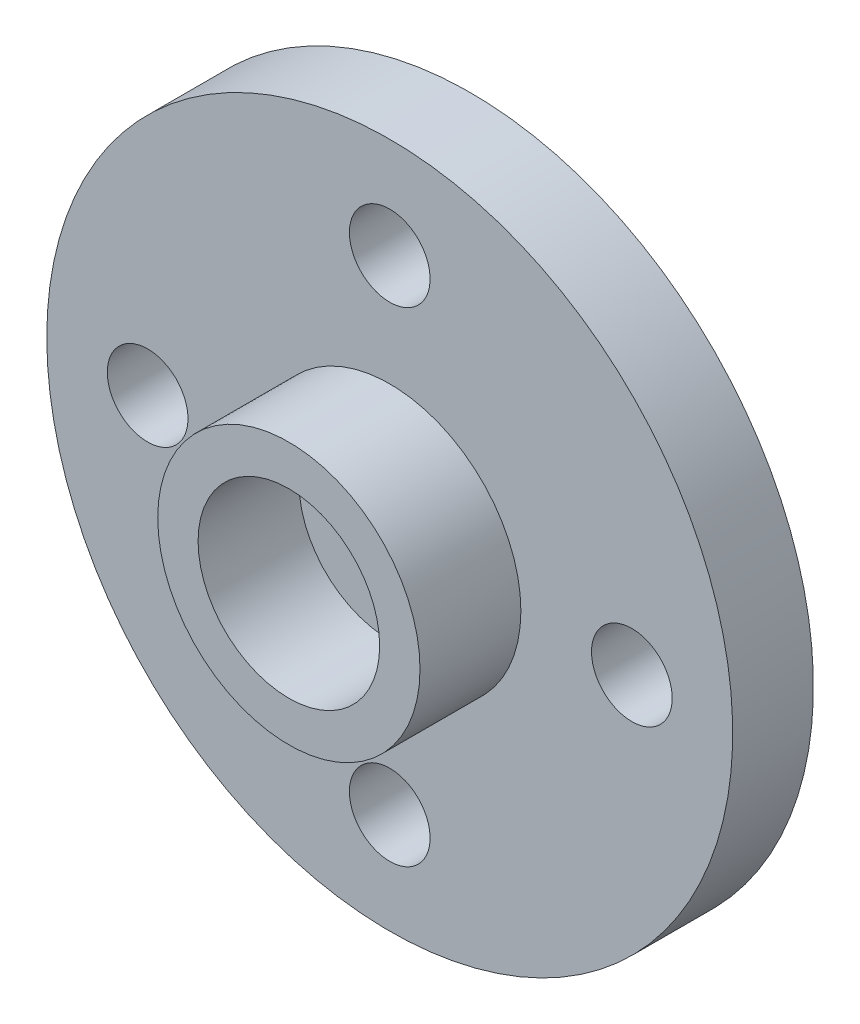
ISO-10303-21;
HEADER;
FILE_DESCRIPTION(('STEP AP214'),'2;1');
FILE_NAME('part.step','',(''),(''),'','','');
FILE_SCHEMA(('AUTOMOTIVE_DESIGN { 1 0 10303 214 1 1 1 1 }'));
ENDSEC;
DATA;
#1=APPLICATION_CONTEXT('core data for automotive mechanical design processes');
#2=APPLICATION_PROTOCOL_DEFINITION('international standard','automotive_design',2000,#1);
#3=PRODUCT_CONTEXT('',#1,'mechanical');
#4=PRODUCT('Part','Part','',(#3));
#5=PRODUCT_RELATED_PRODUCT_CATEGORY('part','',(#4));
#6=PRODUCT_DEFINITION_FORMATION('','',#4);
#7=PRODUCT_DEFINITION_CONTEXT('part definition',#1,'design');
#8=PRODUCT_DEFINITION('design','',#6,#7);
#9=PRODUCT_DEFINITION_SHAPE('','',#8);
#10=(LENGTH_UNIT() NAMED_UNIT(*) SI_UNIT(.MILLI.,.METRE.));
#11=(NAMED_UNIT(*) PLANE_ANGLE_UNIT() SI_UNIT($,.RADIAN.));
#12=(NAMED_UNIT(*) SI_UNIT($,.STERADIAN.) SOLID_ANGLE_UNIT());
#13=UNCERTAINTY_MEASURE_WITH_UNIT(LENGTH_MEASURE(1.E-05),#10,'distance_accuracy_value','');
#14=(GEOMETRIC_REPRESENTATION_CONTEXT(3) GLOBAL_UNCERTAINTY_ASSIGNED_CONTEXT((#13)) GLOBAL_UNIT_ASSIGNED_CONTEXT((#10,
#11,#12)) REPRESENTATION_CONTEXT('',''));
#15=CARTESIAN_POINT('',(0.,0.,0.));
#16=DIRECTION('',(0.,0.,1.));
#17=DIRECTION('',(1.,0.,0.));
#18=AXIS2_PLACEMENT_3D('',#15,#16,#17);
#19=CARTESIAN_POINT('',(0.,0.,4.5));
#20=DIRECTION('',(0.,0.,-1.));
#21=DIRECTION('',(-1.,0.,0.));
#22=AXIS2_PLACEMENT_3D('',#19,#20,#21);
#23=CYLINDRICAL_SURFACE('',#22,3.25);
#24=CARTESIAN_POINT('',(0.,0.,4.5));
#25=DIRECTION('',(0.,0.,1.));
#26=DIRECTION('',(1.,0.,0.));
#27=AXIS2_PLACEMENT_3D('',#24,#25,#26);
#28=CIRCLE('',#27,3.25);
#29=CARTESIAN_POINT('',(3.25,0.,4.5));
#30=VERTEX_POINT('',#29);
#31=EDGE_CURVE('E38',#30,#30,#28,.T.);
#32=ORIENTED_EDGE('',*,*,#31,.F.);
#33=EDGE_LOOP('',(#32));
#34=FACE_BOUND('',#33,.T.);
#35=CARTESIAN_POINT('',(0.,0.,2.));
#36=DIRECTION('',(0.,0.,-1.));
#37=DIRECTION('',(-1.,0.,0.));
#38=AXIS2_PLACEMENT_3D('',#35,#36,#37);
#39=CIRCLE('',#38,3.25);
#40=CARTESIAN_POINT('',(-3.25,0.,2.));
#41=VERTEX_POINT('',#40);
#42=EDGE_CURVE('E10',#41,#41,#39,.T.);
#43=ORIENTED_EDGE('',*,*,#42,.F.);
#44=EDGE_LOOP('',(#43));
#45=FACE_BOUND('',#44,.T.);
#46=ADVANCED_FACE('F31',(#34,#45),#23,.T.);
#47=CARTESIAN_POINT('',(0.,0.,4.5));
#48=DIRECTION('',(0.,0.,-1.));
#49=DIRECTION('',(-1.,0.,0.));
#50=AXIS2_PLACEMENT_3D('',#47,#48,#49);
#51=CYLINDRICAL_SURFACE('',#50,2.25);
#52=CARTESIAN_POINT('',(0.,0.,4.5));
#53=DIRECTION('',(0.,0.,1.));
#54=DIRECTION('',(1.,0.,0.));
#55=AXIS2_PLACEMENT_3D('',#52,#53,#54);
#56=CIRCLE('',#55,2.25);
#57=CARTESIAN_POINT('',(2.25,0.,4.5));
#58=VERTEX_POINT('',#57);
#59=EDGE_CURVE('E43',#58,#58,#56,.T.);
#60=ORIENTED_EDGE('',*,*,#59,.T.);
#61=EDGE_LOOP('',(#60));
#62=FACE_BOUND('',#61,.T.);
#63=CARTESIAN_POINT('',(0.,0.,2.));
#64=DIRECTION('',(0.,0.,-1.));
#65=DIRECTION('',(-1.,0.,0.));
#66=AXIS2_PLACEMENT_3D('',#63,#64,#65);
#67=CIRCLE('',#66,2.25);
#68=CARTESIAN_POINT('',(-2.25,0.,2.));
#69=VERTEX_POINT('',#68);
#70=EDGE_CURVE('E34',#69,#69,#67,.T.);
#71=ORIENTED_EDGE('',*,*,#70,.T.);
#72=EDGE_LOOP('',(#71));
#73=FACE_BOUND('',#72,.T.);
#74=ADVANCED_FACE('F128',(#62,#73),#51,.F.);
#75=CARTESIAN_POINT('',(0.,0.,4.5));
#76=DIRECTION('',(0.,0.,1.));
#77=DIRECTION('',(1.,0.,0.));
#78=AXIS2_PLACEMENT_3D('',#75,#76,#77);
#79=PLANE('',#78);
#80=ORIENTED_EDGE('',*,*,#31,.T.);
#81=EDGE_LOOP('',(#80));
#82=FACE_BOUND('',#81,.T.);
#83=ORIENTED_EDGE('',*,*,#59,.F.);
#84=EDGE_LOOP('',(#83));
#85=FACE_BOUND('',#84,.T.);
#86=ADVANCED_FACE('F133',(#82,#85),#79,.T.);
#87=CARTESIAN_POINT('',(0.,0.,2.));
#88=DIRECTION('',(0.,0.,-1.));
#89=DIRECTION('',(-1.,0.,0.));
#90=AXIS2_PLACEMENT_3D('',#87,#88,#89);
#91=PLANE('',#90);
#92=CARTESIAN_POINT('',(0.,0.,2.));
#93=DIRECTION('',(0.,0.,-1.));
#94=DIRECTION('',(-1.,0.,0.));
#95=AXIS2_PLACEMENT_3D('',#92,#93,#94);
#96=CIRCLE('',#95,0.85);
#97=CARTESIAN_POINT('',(-0.85,0.,2.));
#98=VERTEX_POINT('',#97);
#99=EDGE_CURVE('E59',#98,#98,#96,.T.);
#100=ORIENTED_EDGE('',*,*,#99,.T.);
#101=EDGE_LOOP('',(#100));
#102=FACE_BOUND('',#101,.T.);
#103=ORIENTED_EDGE('',*,*,#70,.F.);
#104=EDGE_LOOP('',(#103));
#105=FACE_BOUND('',#104,.T.);
#106=ADVANCED_FACE('F123',(#102,#105),#91,.F.);
#107=CARTESIAN_POINT('',(0.,0.,2.));
#108=DIRECTION('',(0.,0.,-1.));
#109=DIRECTION('',(-1.,0.,0.));
#110=AXIS2_PLACEMENT_3D('',#107,#108,#109);
#111=CYLINDRICAL_SURFACE('',#110,0.85);
#112=ORIENTED_EDGE('',*,*,#99,.F.);
#113=EDGE_LOOP('',(#112));
#114=FACE_BOUND('',#113,.T.);
#115=CARTESIAN_POINT('',(0.,0.,0.));
#116=DIRECTION('',(0.,0.,-1.));
#117=DIRECTION('',(-1.,0.,0.));
#118=AXIS2_PLACEMENT_3D('',#115,#116,#117);
#119=CIRCLE('',#118,0.85);
#120=CARTESIAN_POINT('',(-0.85,0.,0.));
#121=VERTEX_POINT('',#120);
#122=EDGE_CURVE('E61',#121,#121,#119,.T.);
#123=ORIENTED_EDGE('',*,*,#122,.T.);
#124=EDGE_LOOP('',(#123));
#125=FACE_BOUND('',#124,.T.);
#126=ADVANCED_FACE('F115',(#114,#125),#111,.F.);
#127=CARTESIAN_POINT('',(0.,0.,2.));
#128=DIRECTION('',(0.,0.,-1.));
#129=DIRECTION('',(-1.,0.,0.));
#130=AXIS2_PLACEMENT_3D('',#127,#128,#129);
#131=CYLINDRICAL_SURFACE('',#130,8.5);
#132=CARTESIAN_POINT('',(0.,0.,2.));
#133=DIRECTION('',(0.,0.,-1.));
#134=DIRECTION('',(-1.,0.,0.));
#135=AXIS2_PLACEMENT_3D('',#132,#133,#134);
#136=CIRCLE('',#135,8.5);
#137=CARTESIAN_POINT('',(-8.5,0.,2.));
#138=VERTEX_POINT('',#137);
#139=EDGE_CURVE('E52',#138,#138,#136,.T.);
#140=ORIENTED_EDGE('',*,*,#139,.T.);
#141=EDGE_LOOP('',(#140));
#142=FACE_BOUND('',#141,.T.);
#143=CARTESIAN_POINT('',(0.,0.,0.));
#144=DIRECTION('',(0.,0.,-1.));
#145=DIRECTION('',(-1.,0.,0.));
#146=AXIS2_PLACEMENT_3D('',#143,#144,#145);
#147=CIRCLE('',#146,8.5);
#148=CARTESIAN_POINT('',(-8.5,0.,0.));
#149=VERTEX_POINT('',#148);
#150=EDGE_CURVE('E46',#149,#149,#147,.T.);
#151=ORIENTED_EDGE('',*,*,#150,.F.);
#152=EDGE_LOOP('',(#151));
#153=FACE_BOUND('',#152,.T.);
#154=ADVANCED_FACE('F113',(#142,#153),#131,.T.);
#155=ORIENTED_EDGE('',*,*,#42,.T.);
#156=EDGE_LOOP('',(#155));
#157=FACE_BOUND('',#156,.T.);
#158=CARTESIAN_POINT('',(0.,-6.,2.));
#159=DIRECTION('',(0.,0.,-1.));
#160=DIRECTION('',(-1.,0.,0.));
#161=AXIS2_PLACEMENT_3D('',#158,#159,#160);
#162=CIRCLE('',#161,1.);
#163=CARTESIAN_POINT('',(-1.,-6.,2.));
#164=VERTEX_POINT('',#163);
#165=EDGE_CURVE('E82',#164,#164,#162,.T.);
#166=ORIENTED_EDGE('',*,*,#165,.T.);
#167=EDGE_LOOP('',(#166));
#168=FACE_BOUND('',#167,.T.);
#169=CARTESIAN_POINT('',(-6.,0.,2.));
#170=DIRECTION('',(0.,0.,-1.));
#171=DIRECTION('',(-1.,0.,0.));
#172=AXIS2_PLACEMENT_3D('',#169,#170,#171);
#173=CIRCLE('',#172,0.999999999999999);
#174=CARTESIAN_POINT('',(-7.,0.,2.));
#175=VERTEX_POINT('',#174);
#176=EDGE_CURVE('E76',#175,#175,#173,.T.);
#177=ORIENTED_EDGE('',*,*,#176,.T.);
#178=EDGE_LOOP('',(#177));
#179=FACE_BOUND('',#178,.T.);
#180=CARTESIAN_POINT('',(0.,6.,2.));
#181=DIRECTION('',(0.,0.,-1.));
#182=DIRECTION('',(-1.,0.,0.));
#183=AXIS2_PLACEMENT_3D('',#180,#181,#182);
#184=CIRCLE('',#183,1.);
#185=CARTESIAN_POINT('',(-0.999999999999999,6.,2.));
#186=VERTEX_POINT('',#185);
#187=EDGE_CURVE('E70',#186,#186,#184,.T.);
#188=ORIENTED_EDGE('',*,*,#187,.T.);
#189=EDGE_LOOP('',(#188));
#190=FACE_BOUND('',#189,.T.);
#191=CARTESIAN_POINT('',(6.,0.,2.));
#192=DIRECTION('',(0.,0.,-1.));
#193=DIRECTION('',(-1.,0.,0.));
#194=AXIS2_PLACEMENT_3D('',#191,#192,#193);
#195=CIRCLE('',#194,1.);
#196=CARTESIAN_POINT('',(5.,0.,2.));
#197=VERTEX_POINT('',#196);
#198=EDGE_CURVE('E64',#197,#197,#195,.T.);
#199=ORIENTED_EDGE('',*,*,#198,.T.);
#200=EDGE_LOOP('',(#199));
#201=FACE_BOUND('',#200,.T.);
#202=ORIENTED_EDGE('',*,*,#139,.F.);
#203=EDGE_LOOP('',(#202));
#204=FACE_BOUND('',#203,.T.);
#205=ADVANCED_FACE('F91',(#157,#168,#179,#190,#201,#204),#91,.F.);
#206=CARTESIAN_POINT('',(6.,0.,2.));
#207=DIRECTION('',(0.,0.,-1.));
#208=DIRECTION('',(-1.,0.,0.));
#209=AXIS2_PLACEMENT_3D('',#206,#207,#208);
#210=CYLINDRICAL_SURFACE('',#209,1.);
#211=ORIENTED_EDGE('',*,*,#198,.F.);
#212=EDGE_LOOP('',(#211));
#213=FACE_BOUND('',#212,.T.);
#214=CARTESIAN_POINT('',(6.,0.,0.));
#215=DIRECTION('',(0.,0.,-1.));
#216=DIRECTION('',(-1.,0.,0.));
#217=AXIS2_PLACEMENT_3D('',#214,#215,#216);
#218=CIRCLE('',#217,1.);
#219=CARTESIAN_POINT('',(5.,0.,0.));
#220=VERTEX_POINT('',#219);
#221=EDGE_CURVE('E67',#220,#220,#218,.T.);
#222=ORIENTED_EDGE('',*,*,#221,.T.);
#223=EDGE_LOOP('',(#222));
#224=FACE_BOUND('',#223,.T.);
#225=ADVANCED_FACE('F121',(#213,#224),#210,.F.);
#226=CARTESIAN_POINT('',(0.,6.,2.));
#227=DIRECTION('',(0.,0.,-1.));
#228=DIRECTION('',(-1.,0.,0.));
#229=AXIS2_PLACEMENT_3D('',#226,#227,#228);
#230=CYLINDRICAL_SURFACE('',#229,1.);
#231=ORIENTED_EDGE('',*,*,#187,.F.);
#232=EDGE_LOOP('',(#231));
#233=FACE_BOUND('',#232,.T.);
#234=CARTESIAN_POINT('',(0.,6.,0.));
#235=DIRECTION('',(0.,0.,-1.));
#236=DIRECTION('',(-1.,0.,0.));
#237=AXIS2_PLACEMENT_3D('',#234,#235,#236);
#238=CIRCLE('',#237,1.);
#239=CARTESIAN_POINT('',(-0.999999999999999,6.,0.));
#240=VERTEX_POINT('',#239);
#241=EDGE_CURVE('E73',#240,#240,#238,.T.);
#242=ORIENTED_EDGE('',*,*,#241,.T.);
#243=EDGE_LOOP('',(#242));
#244=FACE_BOUND('',#243,.T.);
#245=ADVANCED_FACE('F150',(#233,#244),#230,.F.);
#246=CARTESIAN_POINT('',(-6.,0.,2.));
#247=DIRECTION('',(0.,0.,-1.));
#248=DIRECTION('',(-1.,0.,0.));
#249=AXIS2_PLACEMENT_3D('',#246,#247,#248);
#250=CYLINDRICAL_SURFACE('',#249,0.999999999999999);
#251=ORIENTED_EDGE('',*,*,#176,.F.);
#252=EDGE_LOOP('',(#251));
#253=FACE_BOUND('',#252,.T.);
#254=CARTESIAN_POINT('',(-6.,0.,0.));
#255=DIRECTION('',(0.,0.,-1.));
#256=DIRECTION('',(-1.,0.,0.));
#257=AXIS2_PLACEMENT_3D('',#254,#255,#256);
#258=CIRCLE('',#257,0.999999999999999);
#259=CARTESIAN_POINT('',(-7.,0.,0.));
#260=VERTEX_POINT('',#259);
#261=EDGE_CURVE('E79',#260,#260,#258,.T.);
#262=ORIENTED_EDGE('',*,*,#261,.T.);
#263=EDGE_LOOP('',(#262));
#264=FACE_BOUND('',#263,.T.);
#265=ADVANCED_FACE('F98',(#253,#264),#250,.F.);
#266=CARTESIAN_POINT('',(0.,-6.,2.));
#267=DIRECTION('',(0.,0.,-1.));
#268=DIRECTION('',(-1.,0.,0.));
#269=AXIS2_PLACEMENT_3D('',#266,#267,#268);
#270=CYLINDRICAL_SURFACE('',#269,1.);
#271=ORIENTED_EDGE('',*,*,#165,.F.);
#272=EDGE_LOOP('',(#271));
#273=FACE_BOUND('',#272,.T.);
#274=CARTESIAN_POINT('',(0.,-6.,0.));
#275=DIRECTION('',(0.,0.,-1.));
#276=DIRECTION('',(-1.,0.,0.));
#277=AXIS2_PLACEMENT_3D('',#274,#275,#276);
#278=CIRCLE('',#277,1.);
#279=CARTESIAN_POINT('',(-1.,-6.,0.));
#280=VERTEX_POINT('',#279);
#281=EDGE_CURVE('E85',#280,#280,#278,.T.);
#282=ORIENTED_EDGE('',*,*,#281,.T.);
#283=EDGE_LOOP('',(#282));
#284=FACE_BOUND('',#283,.T.);
#285=ADVANCED_FACE('F94',(#273,#284),#270,.F.);
#286=CARTESIAN_POINT('',(0.,0.,0.));
#287=DIRECTION('',(0.,0.,1.));
#288=DIRECTION('',(1.,0.,0.));
#289=AXIS2_PLACEMENT_3D('',#286,#287,#288);
#290=PLANE('',#289);
#291=ORIENTED_EDGE('',*,*,#122,.F.);
#292=EDGE_LOOP('',(#291));
#293=FACE_BOUND('',#292,.T.);
#294=ORIENTED_EDGE('',*,*,#281,.F.);
#295=EDGE_LOOP('',(#294));
#296=FACE_BOUND('',#295,.T.);
#297=ORIENTED_EDGE('',*,*,#261,.F.);
#298=EDGE_LOOP('',(#297));
#299=FACE_BOUND('',#298,.T.);
#300=ORIENTED_EDGE('',*,*,#241,.F.);
#301=EDGE_LOOP('',(#300));
#302=FACE_BOUND('',#301,.T.);
#303=ORIENTED_EDGE('',*,*,#221,.F.);
#304=EDGE_LOOP('',(#303));
#305=FACE_BOUND('',#304,.T.);
#306=ORIENTED_EDGE('',*,*,#150,.T.);
#307=EDGE_LOOP('',(#306));
#308=FACE_BOUND('',#307,.T.);
#309=ADVANCED_FACE('F97',(#293,#296,#299,#302,#305,#308),#290,.F.);
#310=CLOSED_SHELL('',(#46,#74,#86,#106,#126,#154,#205,#225,#245,#265,#285,#309));
#311=MANIFOLD_SOLID_BREP('B2',#310);
#312=ADVANCED_BREP_SHAPE_REPRESENTATION('',(#18,#311),#14);
#313=SHAPE_DEFINITION_REPRESENTATION(#9,#312);
ENDSEC;
END-ISO-10303-21;
